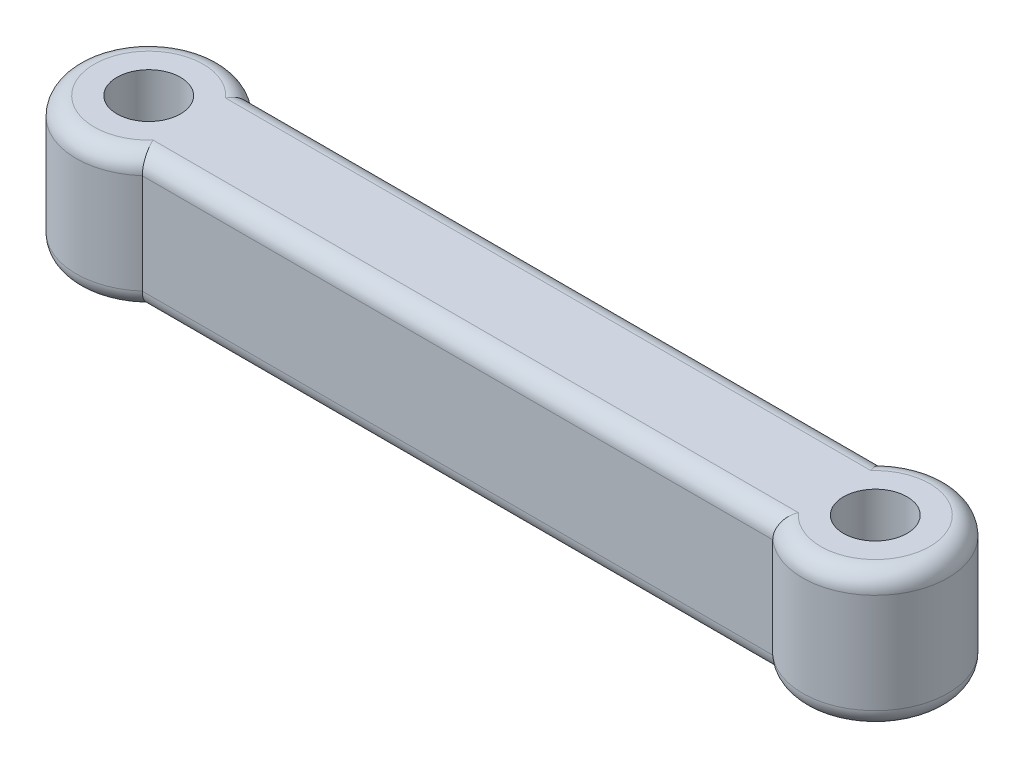
ISO-10303-21;
HEADER;
FILE_DESCRIPTION(('STEP AP214'),'2;1');
FILE_NAME('part.step','',(''),(''),'','','');
FILE_SCHEMA(('AUTOMOTIVE_DESIGN { 1 0 10303 214 1 1 1 1 }'));
ENDSEC;
DATA;
#1=APPLICATION_CONTEXT('core data for automotive mechanical design processes');
#2=APPLICATION_PROTOCOL_DEFINITION('international standard','automotive_design',2000,#1);
#3=PRODUCT_CONTEXT('',#1,'mechanical');
#4=PRODUCT('Part','Part','',(#3));
#5=PRODUCT_RELATED_PRODUCT_CATEGORY('part','',(#4));
#6=PRODUCT_DEFINITION_FORMATION('','',#4);
#7=PRODUCT_DEFINITION_CONTEXT('part definition',#1,'design');
#8=PRODUCT_DEFINITION('design','',#6,#7);
#9=PRODUCT_DEFINITION_SHAPE('','',#8);
#10=(LENGTH_UNIT() NAMED_UNIT(*) SI_UNIT(.MILLI.,.METRE.));
#11=(NAMED_UNIT(*) PLANE_ANGLE_UNIT() SI_UNIT($,.RADIAN.));
#12=(NAMED_UNIT(*) SI_UNIT($,.STERADIAN.) SOLID_ANGLE_UNIT());
#13=UNCERTAINTY_MEASURE_WITH_UNIT(LENGTH_MEASURE(1.E-05),#10,'distance_accuracy_value','');
#14=(GEOMETRIC_REPRESENTATION_CONTEXT(3) GLOBAL_UNCERTAINTY_ASSIGNED_CONTEXT((#13)) GLOBAL_UNIT_ASSIGNED_CONTEXT((#10,
#11,#12)) REPRESENTATION_CONTEXT('',''));
#15=CARTESIAN_POINT('',(0.,0.,0.));
#16=DIRECTION('',(0.,0.,1.));
#17=DIRECTION('',(1.,0.,0.));
#18=AXIS2_PLACEMENT_3D('',#15,#16,#17);
#19=CARTESIAN_POINT('',(0.,7.5,0.));
#20=DIRECTION('',(0.,-1.,0.));
#21=DIRECTION('',(0.,0.,-1.));
#22=AXIS2_PLACEMENT_3D('',#19,#20,#21);
#23=CYLINDRICAL_SURFACE('',#22,4.);
#24=DIRECTION('',(0.,-1.,0.));
#25=VECTOR('',#24,1.);
#26=CARTESIAN_POINT('',(2.6457513110646,7.5,-3.));
#27=LINE('',#26,#25);
#28=CARTESIAN_POINT('',(2.6457513110646,6.5,-3.));
#29=VERTEX_POINT('',#28);
#30=CARTESIAN_POINT('',(2.6457513110646,1.,-3.));
#31=VERTEX_POINT('',#30);
#32=EDGE_CURVE('E94',#29,#31,#27,.T.);
#33=ORIENTED_EDGE('',*,*,#32,.T.);
#34=CARTESIAN_POINT('',(0.,1.,0.));
#35=DIRECTION('',(0.,1.,0.));
#36=DIRECTION('',(0.,0.,1.));
#37=AXIS2_PLACEMENT_3D('',#34,#35,#36);
#38=CIRCLE('',#37,4.);
#39=CARTESIAN_POINT('',(2.6457513110646,1.,3.));
#40=VERTEX_POINT('',#39);
#41=EDGE_CURVE('E223',#31,#40,#38,.T.);
#42=ORIENTED_EDGE('',*,*,#41,.T.);
#43=DIRECTION('',(0.,-1.,0.));
#44=VECTOR('',#43,1.);
#45=CARTESIAN_POINT('',(2.6457513110646,7.5,3.));
#46=LINE('',#45,#44);
#47=CARTESIAN_POINT('',(2.6457513110646,6.5,3.));
#48=VERTEX_POINT('',#47);
#49=EDGE_CURVE('E116',#48,#40,#46,.T.);
#50=ORIENTED_EDGE('',*,*,#49,.F.);
#51=CARTESIAN_POINT('',(0.,6.5,0.));
#52=DIRECTION('',(0.,1.,0.));
#53=DIRECTION('',(0.,0.,1.));
#54=AXIS2_PLACEMENT_3D('',#51,#52,#53);
#55=CIRCLE('',#54,4.);
#56=EDGE_CURVE('E237',#48,#29,#55,.F.);
#57=ORIENTED_EDGE('',*,*,#56,.T.);
#58=EDGE_LOOP('',(#33,#42,#50,#57));
#59=FACE_BOUND('',#58,.T.);
#60=ADVANCED_FACE('F16',(#59),#23,.T.);
#61=CARTESIAN_POINT('',(0.,7.5,3.));
#62=DIRECTION('',(0.,0.,1.));
#63=DIRECTION('',(1.,0.,0.));
#64=AXIS2_PLACEMENT_3D('',#61,#62,#63);
#65=PLANE('',#64);
#66=ORIENTED_EDGE('',*,*,#49,.T.);
#67=DIRECTION('',(-1.,0.,0.));
#68=VECTOR('',#67,1.);
#69=CARTESIAN_POINT('',(37.3542486889354,1.,3.));
#70=LINE('',#69,#68);
#71=CARTESIAN_POINT('',(37.3542486889354,1.,3.));
#72=VERTEX_POINT('',#71);
#73=EDGE_CURVE('E242',#40,#72,#70,.F.);
#74=ORIENTED_EDGE('',*,*,#73,.T.);
#75=DIRECTION('',(0.,-1.,0.));
#76=VECTOR('',#75,1.);
#77=CARTESIAN_POINT('',(37.3542486889354,7.5,3.));
#78=LINE('',#77,#76);
#79=CARTESIAN_POINT('',(37.3542486889354,6.5,3.));
#80=VERTEX_POINT('',#79);
#81=EDGE_CURVE('E110',#80,#72,#78,.T.);
#82=ORIENTED_EDGE('',*,*,#81,.F.);
#83=DIRECTION('',(-1.,0.,0.));
#84=VECTOR('',#83,1.);
#85=CARTESIAN_POINT('',(0.,6.5,3.));
#86=LINE('',#85,#84);
#87=EDGE_CURVE('E240',#80,#48,#86,.T.);
#88=ORIENTED_EDGE('',*,*,#87,.T.);
#89=EDGE_LOOP('',(#66,#74,#82,#88));
#90=FACE_BOUND('',#89,.T.);
#91=ADVANCED_FACE('F159',(#90),#65,.T.);
#92=CARTESIAN_POINT('',(40.,7.5,0.));
#93=DIRECTION('',(0.,-1.,0.));
#94=DIRECTION('',(0.,0.,-1.));
#95=AXIS2_PLACEMENT_3D('',#92,#93,#94);
#96=CYLINDRICAL_SURFACE('',#95,4.);
#97=ORIENTED_EDGE('',*,*,#81,.T.);
#98=CARTESIAN_POINT('',(40.,1.,0.));
#99=DIRECTION('',(0.,1.,0.));
#100=DIRECTION('',(0.,0.,1.));
#101=AXIS2_PLACEMENT_3D('',#98,#99,#100);
#102=CIRCLE('',#101,4.);
#103=CARTESIAN_POINT('',(37.3542486889354,1.,-3.));
#104=VERTEX_POINT('',#103);
#105=EDGE_CURVE('E109',#72,#104,#102,.T.);
#106=ORIENTED_EDGE('',*,*,#105,.T.);
#107=DIRECTION('',(0.,-1.,0.));
#108=VECTOR('',#107,1.);
#109=CARTESIAN_POINT('',(37.3542486889354,7.5,-3.));
#110=LINE('',#109,#108);
#111=CARTESIAN_POINT('',(37.3542486889354,6.5,-3.));
#112=VERTEX_POINT('',#111);
#113=EDGE_CURVE('E92',#112,#104,#110,.T.);
#114=ORIENTED_EDGE('',*,*,#113,.F.);
#115=CARTESIAN_POINT('',(40.,6.5,0.));
#116=DIRECTION('',(0.,1.,0.));
#117=DIRECTION('',(0.,0.,1.));
#118=AXIS2_PLACEMENT_3D('',#115,#116,#117);
#119=CIRCLE('',#118,4.);
#120=EDGE_CURVE('E106',#112,#80,#119,.F.);
#121=ORIENTED_EDGE('',*,*,#120,.T.);
#122=EDGE_LOOP('',(#97,#106,#114,#121));
#123=FACE_BOUND('',#122,.T.);
#124=ADVANCED_FACE('F105',(#123),#96,.T.);
#125=CARTESIAN_POINT('',(0.,7.5,-3.));
#126=DIRECTION('',(0.,0.,1.));
#127=DIRECTION('',(1.,0.,0.));
#128=AXIS2_PLACEMENT_3D('',#125,#126,#127);
#129=PLANE('',#128);
#130=ORIENTED_EDGE('',*,*,#113,.T.);
#131=DIRECTION('',(-1.,0.,0.));
#132=VECTOR('',#131,1.);
#133=CARTESIAN_POINT('',(0.,1.,-3.));
#134=LINE('',#133,#132);
#135=EDGE_CURVE('E98',#104,#31,#134,.T.);
#136=ORIENTED_EDGE('',*,*,#135,.T.);
#137=ORIENTED_EDGE('',*,*,#32,.F.);
#138=DIRECTION('',(-1.,0.,0.));
#139=VECTOR('',#138,1.);
#140=CARTESIAN_POINT('',(37.3542486889354,6.5,-3.));
#141=LINE('',#140,#139);
#142=EDGE_CURVE('E89',#29,#112,#141,.F.);
#143=ORIENTED_EDGE('',*,*,#142,.T.);
#144=EDGE_LOOP('',(#130,#136,#137,#143));
#145=FACE_BOUND('',#144,.T.);
#146=ADVANCED_FACE('F91',(#145),#129,.F.);
#147=CARTESIAN_POINT('',(0.,7.5,0.));
#148=DIRECTION('',(0.,-1.,0.));
#149=DIRECTION('',(0.,0.,-1.));
#150=AXIS2_PLACEMENT_3D('',#147,#148,#149);
#151=CYLINDRICAL_SURFACE('',#150,1.75);
#152=CARTESIAN_POINT('',(0.,7.5,0.));
#153=DIRECTION('',(0.,1.,0.));
#154=DIRECTION('',(0.,0.,1.));
#155=AXIS2_PLACEMENT_3D('',#152,#153,#154);
#156=CIRCLE('',#155,1.75);
#157=CARTESIAN_POINT('',(0.,7.5,1.75));
#158=VERTEX_POINT('',#157);
#159=EDGE_CURVE('E267',#158,#158,#156,.T.);
#160=ORIENTED_EDGE('',*,*,#159,.T.);
#161=EDGE_LOOP('',(#160));
#162=FACE_BOUND('',#161,.T.);
#163=CARTESIAN_POINT('',(0.,0.,0.));
#164=DIRECTION('',(0.,1.,0.));
#165=DIRECTION('',(0.,0.,1.));
#166=AXIS2_PLACEMENT_3D('',#163,#164,#165);
#167=CIRCLE('',#166,1.75);
#168=CARTESIAN_POINT('',(0.,0.,1.75));
#169=VERTEX_POINT('',#168);
#170=EDGE_CURVE('E261',#169,#169,#167,.T.);
#171=ORIENTED_EDGE('',*,*,#170,.F.);
#172=EDGE_LOOP('',(#171));
#173=FACE_BOUND('',#172,.T.);
#174=ADVANCED_FACE('F169',(#162,#173),#151,.F.);
#175=CARTESIAN_POINT('',(40.,7.5,0.));
#176=DIRECTION('',(0.,-1.,0.));
#177=DIRECTION('',(0.,0.,-1.));
#178=AXIS2_PLACEMENT_3D('',#175,#176,#177);
#179=CYLINDRICAL_SURFACE('',#178,1.75);
#180=CARTESIAN_POINT('',(40.,7.5,0.));
#181=DIRECTION('',(0.,1.,0.));
#182=DIRECTION('',(0.,0.,1.));
#183=AXIS2_PLACEMENT_3D('',#180,#181,#182);
#184=CIRCLE('',#183,1.75);
#185=CARTESIAN_POINT('',(40.,7.5,1.75));
#186=VERTEX_POINT('',#185);
#187=EDGE_CURVE('E270',#186,#186,#184,.T.);
#188=ORIENTED_EDGE('',*,*,#187,.T.);
#189=EDGE_LOOP('',(#188));
#190=FACE_BOUND('',#189,.T.);
#191=CARTESIAN_POINT('',(40.,0.,0.));
#192=DIRECTION('',(0.,1.,0.));
#193=DIRECTION('',(0.,0.,1.));
#194=AXIS2_PLACEMENT_3D('',#191,#192,#193);
#195=CIRCLE('',#194,1.75);
#196=CARTESIAN_POINT('',(40.,0.,1.75));
#197=VERTEX_POINT('',#196);
#198=EDGE_CURVE('E263',#197,#197,#195,.T.);
#199=ORIENTED_EDGE('',*,*,#198,.F.);
#200=EDGE_LOOP('',(#199));
#201=FACE_BOUND('',#200,.T.);
#202=ADVANCED_FACE('F172',(#190,#201),#179,.F.);
#203=CARTESIAN_POINT('',(0.,7.5,0.));
#204=DIRECTION('',(0.,1.,0.));
#205=DIRECTION('',(0.,0.,1.));
#206=AXIS2_PLACEMENT_3D('',#203,#204,#205);
#207=PLANE('',#206);
#208=DIRECTION('',(-1.,0.,0.));
#209=VECTOR('',#208,1.);
#210=CARTESIAN_POINT('',(0.,7.5,2.));
#211=LINE('',#210,#209);
#212=CARTESIAN_POINT('',(2.23606797749979,7.5,2.));
#213=VERTEX_POINT('',#212);
#214=CARTESIAN_POINT('',(37.7639320225002,7.5,2.));
#215=VERTEX_POINT('',#214);
#216=EDGE_CURVE('E244',#213,#215,#211,.F.);
#217=ORIENTED_EDGE('',*,*,#216,.T.);
#218=CARTESIAN_POINT('',(40.,7.5,0.));
#219=DIRECTION('',(0.,1.,0.));
#220=DIRECTION('',(0.,0.,1.));
#221=AXIS2_PLACEMENT_3D('',#218,#219,#220);
#222=CIRCLE('',#221,3.);
#223=CARTESIAN_POINT('',(37.7639320225002,7.5,-2.));
#224=VERTEX_POINT('',#223);
#225=EDGE_CURVE('E11',#215,#224,#222,.T.);
#226=ORIENTED_EDGE('',*,*,#225,.T.);
#227=DIRECTION('',(-1.,0.,0.));
#228=VECTOR('',#227,1.);
#229=CARTESIAN_POINT('',(2.6457513110646,7.5,-2.));
#230=LINE('',#229,#228);
#231=CARTESIAN_POINT('',(2.2360679774998,7.5,-2.));
#232=VERTEX_POINT('',#231);
#233=EDGE_CURVE('E30',#224,#232,#230,.T.);
#234=ORIENTED_EDGE('',*,*,#233,.T.);
#235=CARTESIAN_POINT('',(0.,7.5,0.));
#236=DIRECTION('',(0.,1.,0.));
#237=DIRECTION('',(0.,0.,1.));
#238=AXIS2_PLACEMENT_3D('',#235,#236,#237);
#239=CIRCLE('',#238,3.);
#240=EDGE_CURVE('E246',#232,#213,#239,.T.);
#241=ORIENTED_EDGE('',*,*,#240,.T.);
#242=EDGE_LOOP('',(#217,#226,#234,#241));
#243=FACE_BOUND('',#242,.T.);
#244=ORIENTED_EDGE('',*,*,#159,.F.);
#245=EDGE_LOOP('',(#244));
#246=FACE_BOUND('',#245,.T.);
#247=ORIENTED_EDGE('',*,*,#187,.F.);
#248=EDGE_LOOP('',(#247));
#249=FACE_BOUND('',#248,.T.);
#250=ADVANCED_FACE('F212',(#243,#246,#249),#207,.T.);
#251=CARTESIAN_POINT('',(0.,0.,0.));
#252=DIRECTION('',(0.,1.,0.));
#253=DIRECTION('',(0.,0.,1.));
#254=AXIS2_PLACEMENT_3D('',#251,#252,#253);
#255=PLANE('',#254);
#256=DIRECTION('',(-1.,0.,0.));
#257=VECTOR('',#256,1.);
#258=CARTESIAN_POINT('',(0.,0.,-2.));
#259=LINE('',#258,#257);
#260=CARTESIAN_POINT('',(2.2360679774998,0.,-2.));
#261=VERTEX_POINT('',#260);
#262=CARTESIAN_POINT('',(37.7639320225002,0.,-2.));
#263=VERTEX_POINT('',#262);
#264=EDGE_CURVE('E227',#261,#263,#259,.F.);
#265=ORIENTED_EDGE('',*,*,#264,.T.);
#266=CARTESIAN_POINT('',(40.,0.,0.));
#267=DIRECTION('',(0.,1.,0.));
#268=DIRECTION('',(0.,0.,1.));
#269=AXIS2_PLACEMENT_3D('',#266,#267,#268);
#270=CIRCLE('',#269,3.);
#271=CARTESIAN_POINT('',(37.7639320225002,0.,2.));
#272=VERTEX_POINT('',#271);
#273=EDGE_CURVE('E99',#263,#272,#270,.F.);
#274=ORIENTED_EDGE('',*,*,#273,.T.);
#275=DIRECTION('',(-1.,0.,0.));
#276=VECTOR('',#275,1.);
#277=CARTESIAN_POINT('',(2.6457513110646,0.,2.));
#278=LINE('',#277,#276);
#279=CARTESIAN_POINT('',(2.23606797749979,0.,2.));
#280=VERTEX_POINT('',#279);
#281=EDGE_CURVE('E232',#272,#280,#278,.T.);
#282=ORIENTED_EDGE('',*,*,#281,.T.);
#283=CARTESIAN_POINT('',(0.,0.,0.));
#284=DIRECTION('',(0.,1.,0.));
#285=DIRECTION('',(0.,0.,1.));
#286=AXIS2_PLACEMENT_3D('',#283,#284,#285);
#287=CIRCLE('',#286,3.);
#288=EDGE_CURVE('E221',#280,#261,#287,.F.);
#289=ORIENTED_EDGE('',*,*,#288,.T.);
#290=EDGE_LOOP('',(#265,#274,#282,#289));
#291=FACE_BOUND('',#290,.T.);
#292=ORIENTED_EDGE('',*,*,#170,.T.);
#293=EDGE_LOOP('',(#292));
#294=FACE_BOUND('',#293,.T.);
#295=ORIENTED_EDGE('',*,*,#198,.T.);
#296=EDGE_LOOP('',(#295));
#297=FACE_BOUND('',#296,.T.);
#298=ADVANCED_FACE('F206',(#291,#294,#297),#255,.F.);
#299=CARTESIAN_POINT('',(0.,1.,0.));
#300=DIRECTION('',(0.,1.,0.));
#301=DIRECTION('',(0.,0.,1.));
#302=AXIS2_PLACEMENT_3D('',#299,#300,#301);
#303=TOROIDAL_SURFACE('',#302,3.,1.);
#304=CARTESIAN_POINT('',(2.6457513110646,1.,-3.));
#305=CARTESIAN_POINT('',(2.64575127092674,0.973228555836765,-3.00000069615422));
#306=CARTESIAN_POINT('',(2.64534472387869,0.946470374588335,-2.99892418210553));
#307=CARTESIAN_POINT('',(2.64372309753721,0.893154745547511,-2.99463542267004));
#308=CARTESIAN_POINT('',(2.6425081506653,0.866597265599314,-2.99142352707368));
#309=CARTESIAN_POINT('',(2.63766755879304,0.787642395185727,-2.97863953817245));
#310=CARTESIAN_POINT('',(2.63284608949272,0.735789427416032,-2.96591886758874));
#311=CARTESIAN_POINT('',(2.62014889631173,0.635132507808938,-2.93257021261229));
#312=CARTESIAN_POINT('',(2.6122734290892,0.586328300153661,-2.91194289269645));
#313=CARTESIAN_POINT('',(2.59367806237857,0.492986585810994,-2.86353983623308));
#314=CARTESIAN_POINT('',(2.58295750011554,0.448450076593601,-2.83576243409405));
#315=CARTESIAN_POINT('',(2.5586466526755,0.363675490639332,-2.77326086489196));
#316=CARTESIAN_POINT('',(2.54499277783535,0.323568675850964,-2.73838385103096));
#317=CARTESIAN_POINT('',(2.51530582313919,0.24977021914481,-2.66327163173881));
#318=CARTESIAN_POINT('',(2.49927205306725,0.216080444787168,-2.62303487222554));
#319=CARTESIAN_POINT('',(2.46413572570384,0.153868158072763,-2.53581906446158));
#320=CARTESIAN_POINT('',(2.44490584872289,0.125784424606513,-2.48857881181936));
#321=CARTESIAN_POINT('',(2.40457913446054,0.077914490927446,-2.39079733884034));
#322=CARTESIAN_POINT('',(2.38348165304688,0.0581311671146035,-2.3402549812023));
#323=CARTESIAN_POINT('',(2.34215580757248,0.0286919397689751,-2.24265609980384));
#324=CARTESIAN_POINT('',(2.32206840218565,0.0181914124767634,-2.19579002502582));
#325=CARTESIAN_POINT('',(2.28108331255519,0.00402153912134074,-2.10146140103966));
#326=CARTESIAN_POINT('',(2.26018725358578,0.00033915042658557,-2.05400016588306));
#327=CARTESIAN_POINT('',(2.23806117954649,7.43641947154835E-06,-2.00445841648615));
#328=CARTESIAN_POINT('',(2.23706482870276,-1.78314518430361E-08,-2.00222901681706));
#329=CARTESIAN_POINT('',(2.2360679774998,0.,-2.));
#330=B_SPLINE_CURVE_WITH_KNOTS('',3,(#304,#305,#306,#307,#308,#309,#310,#311,#312,#313,#314,
#315,#316,#317,#318,#319,#320,#321,#322,#323,#324,#325,#326,#327,#328,#329),.UNSPECIFIED.,.F.,
.F.,(4,2,2,2,2,2,2,2,2,2,2,2,4),(0.,0.0802634951669375,0.160513845850261,0.320501915607237,
0.480476542871452,0.640488469552238,0.804401347479019,0.968361856552137,1.14229241042013,
1.31628318799655,1.47202369345237,1.62746596897456,1.63479168634692),.UNSPECIFIED.);
#331=EDGE_CURVE('E193',#261,#31,#330,.F.);
#332=ORIENTED_EDGE('',*,*,#331,.F.);
#333=ORIENTED_EDGE('',*,*,#288,.F.);
#334=CARTESIAN_POINT('',(2.6457513110646,1.,3.));
#335=CARTESIAN_POINT('',(2.64575127092673,0.973228555836765,3.00000069615423));
#336=CARTESIAN_POINT('',(2.64534472387869,0.946470374588335,2.99892418210553));
#337=CARTESIAN_POINT('',(2.64372309753721,0.893154745547511,2.99463542267004));
#338=CARTESIAN_POINT('',(2.6425081506653,0.866597265599313,2.99142352707368));
#339=CARTESIAN_POINT('',(2.63766755879304,0.787642395185727,2.97863953817245));
#340=CARTESIAN_POINT('',(2.63284608949271,0.73578942741603,2.96591886758875));
#341=CARTESIAN_POINT('',(2.62014889631172,0.635132507808937,2.9325702126123));
#342=CARTESIAN_POINT('',(2.6122734290892,0.586328300153662,2.91194289269645));
#343=CARTESIAN_POINT('',(2.59367806237857,0.492986585810996,2.86353983623308));
#344=CARTESIAN_POINT('',(2.58295750011553,0.448450076593601,2.83576243409405));
#345=CARTESIAN_POINT('',(2.55864665267549,0.363675490639332,2.77326086489196));
#346=CARTESIAN_POINT('',(2.54499277783535,0.323568675850966,2.73838385103096));
#347=CARTESIAN_POINT('',(2.51530582313919,0.249770219144811,2.66327163173881));
#348=CARTESIAN_POINT('',(2.49927205306724,0.216080444787167,2.62303487222555));
#349=CARTESIAN_POINT('',(2.46413572570383,0.153868158072763,2.53581906446159));
#350=CARTESIAN_POINT('',(2.44490584872289,0.125784424606514,2.48857881181936));
#351=CARTESIAN_POINT('',(2.40457913446054,0.0779144909274477,2.39079733884034));
#352=CARTESIAN_POINT('',(2.38348165304688,0.0581311671146037,2.3402549812023));
#353=CARTESIAN_POINT('',(2.34215580757246,0.0286919397689751,2.24265609980385));
#354=CARTESIAN_POINT('',(2.32206840218562,0.0181914124767641,2.19579002502583));
#355=CARTESIAN_POINT('',(2.28108331255522,0.00402153912134111,2.10146140103965));
#356=CARTESIAN_POINT('',(2.26018725358588,0.000339150426584755,2.05400016588302));
#357=CARTESIAN_POINT('',(2.23806117954649,7.43641947144235E-06,2.00445841648616));
#358=CARTESIAN_POINT('',(2.23706482870276,-1.78314519116548E-08,2.00222901681706));
#359=CARTESIAN_POINT('',(2.23606797749979,0.,2.));
#360=B_SPLINE_CURVE_WITH_KNOTS('',3,(#334,#335,#336,#337,#338,#339,#340,#341,#342,#343,#344,
#345,#346,#347,#348,#349,#350,#351,#352,#353,#354,#355,#356,#357,#358,#359),.UNSPECIFIED.,.F.,
.F.,(4,2,2,2,2,2,2,2,2,2,2,2,4),(0.,0.0802634951669372,0.160513845850261,0.320501915607237,
0.480476542871452,0.640488469552238,0.804401347479018,0.968361856552134,1.14229241042013,
1.31628318799655,1.47202369345237,1.62746596897455,1.63479168634692),.UNSPECIFIED.);
#361=EDGE_CURVE('E129',#40,#280,#360,.T.);
#362=ORIENTED_EDGE('',*,*,#361,.F.);
#363=ORIENTED_EDGE('',*,*,#41,.F.);
#364=EDGE_LOOP('',(#332,#333,#362,#363));
#365=FACE_BOUND('',#364,.T.);
#366=ADVANCED_FACE('F201',(#365),#303,.T.);
#367=CARTESIAN_POINT('',(0.,1.,2.));
#368=DIRECTION('',(1.,0.,0.));
#369=DIRECTION('',(0.,0.,-1.));
#370=AXIS2_PLACEMENT_3D('',#367,#368,#369);
#371=CYLINDRICAL_SURFACE('',#370,1.);
#372=ORIENTED_EDGE('',*,*,#361,.T.);
#373=ORIENTED_EDGE('',*,*,#281,.F.);
#374=CARTESIAN_POINT('',(37.3542486889354,1.,3.));
#375=CARTESIAN_POINT('',(37.3542487290733,0.973228555836765,3.00000069615422));
#376=CARTESIAN_POINT('',(37.3546552761213,0.946470374588335,2.99892418210553));
#377=CARTESIAN_POINT('',(37.3562769024628,0.893154745547511,2.99463542267003));
#378=CARTESIAN_POINT('',(37.3574918493347,0.866597265599314,2.99142352707368));
#379=CARTESIAN_POINT('',(37.362332441207,0.787642395185727,2.97863953817245));
#380=CARTESIAN_POINT('',(37.3671539105073,0.735789427416031,2.96591886758874));
#381=CARTESIAN_POINT('',(37.3798511036883,0.635132507808937,2.93257021261229));
#382=CARTESIAN_POINT('',(37.3877265709108,0.58632830015366,2.91194289269644));
#383=CARTESIAN_POINT('',(37.4063219376214,0.492986585810994,2.86353983623308));
#384=CARTESIAN_POINT('',(37.4170424998845,0.448450076593601,2.83576243409405));
#385=CARTESIAN_POINT('',(37.4413533473245,0.363675490639332,2.77326086489196));
#386=CARTESIAN_POINT('',(37.4550072221646,0.323568675850963,2.73838385103095));
#387=CARTESIAN_POINT('',(37.4846941768608,0.249770219144809,2.66327163173881));
#388=CARTESIAN_POINT('',(37.5007279469328,0.216080444787168,2.62303487222555));
#389=CARTESIAN_POINT('',(37.5358642742962,0.153868158072763,2.53581906446158));
#390=CARTESIAN_POINT('',(37.5550941512771,0.125784424606511,2.48857881181935));
#391=CARTESIAN_POINT('',(37.5954208655395,0.077914490927445,2.39079733884033));
#392=CARTESIAN_POINT('',(37.6165183469532,0.0581311671146037,2.3402549812023));
#393=CARTESIAN_POINT('',(37.6578441924275,0.0286919397689766,2.24265609980385));
#394=CARTESIAN_POINT('',(37.6779315978143,0.0181914124767646,2.19579002502581));
#395=CARTESIAN_POINT('',(37.7189166874448,0.00402153912134098,2.10146140103967));
#396=CARTESIAN_POINT('',(37.7398127464143,0.000339150426585215,2.05400016588309));
#397=CARTESIAN_POINT('',(37.7619388204535,7.43641947148521E-06,2.00445841648616));
#398=CARTESIAN_POINT('',(37.7629351712972,-1.78314518897337E-08,2.00222901681706));
#399=CARTESIAN_POINT('',(37.7639320225002,0.,2.));
#400=B_SPLINE_CURVE_WITH_KNOTS('',3,(#374,#375,#376,#377,#378,#379,#380,#381,#382,#383,#384,
#385,#386,#387,#388,#389,#390,#391,#392,#393,#394,#395,#396,#397,#398,#399),.UNSPECIFIED.,.F.,
.F.,(4,2,2,2,2,2,2,2,2,2,2,2,4),(0.,0.0802634951669373,0.160513845850261,0.320501915607238,
0.480476542871452,0.640488469552238,0.80440134747902,0.968361856552137,1.14229241042014,
1.31628318799656,1.47202369345237,1.62746596897454,1.63479168634691),.UNSPECIFIED.);
#401=EDGE_CURVE('E188',#72,#272,#400,.T.);
#402=ORIENTED_EDGE('',*,*,#401,.F.);
#403=ORIENTED_EDGE('',*,*,#73,.F.);
#404=EDGE_LOOP('',(#372,#373,#402,#403));
#405=FACE_BOUND('',#404,.T.);
#406=ADVANCED_FACE('F198',(#405),#371,.T.);
#407=CARTESIAN_POINT('',(0.,1.,-2.));
#408=DIRECTION('',(-1.,0.,0.));
#409=DIRECTION('',(0.,0.,1.));
#410=AXIS2_PLACEMENT_3D('',#407,#408,#409);
#411=CYLINDRICAL_SURFACE('',#410,1.);
#412=ORIENTED_EDGE('',*,*,#331,.T.);
#413=ORIENTED_EDGE('',*,*,#135,.F.);
#414=CARTESIAN_POINT('',(37.3542486889354,1.,-3.));
#415=CARTESIAN_POINT('',(37.3542487290733,0.973228555836765,-3.00000069615423));
#416=CARTESIAN_POINT('',(37.3546552761213,0.946470374588334,-2.99892418210553));
#417=CARTESIAN_POINT('',(37.3562769024628,0.89315474554751,-2.99463542267005));
#418=CARTESIAN_POINT('',(37.3574918493347,0.866597265599313,-2.99142352707369));
#419=CARTESIAN_POINT('',(37.362332441207,0.787642395185727,-2.97863953817245));
#420=CARTESIAN_POINT('',(37.3671539105073,0.735789427416032,-2.96591886758874));
#421=CARTESIAN_POINT('',(37.3798511036883,0.635132507808937,-2.93257021261229));
#422=CARTESIAN_POINT('',(37.3877265709108,0.586328300153658,-2.91194289269645));
#423=CARTESIAN_POINT('',(37.4063219376214,0.492986585810992,-2.86353983623309));
#424=CARTESIAN_POINT('',(37.4170424998845,0.448450076593601,-2.83576243409405));
#425=CARTESIAN_POINT('',(37.4413533473245,0.363675490639332,-2.77326086489196));
#426=CARTESIAN_POINT('',(37.4550072221647,0.323568675850962,-2.73838385103096));
#427=CARTESIAN_POINT('',(37.4846941768608,0.249770219144807,-2.66327163173881));
#428=CARTESIAN_POINT('',(37.5007279469328,0.216080444787168,-2.62303487222555));
#429=CARTESIAN_POINT('',(37.5358642742962,0.153868158072763,-2.53581906446158));
#430=CARTESIAN_POINT('',(37.5550941512771,0.125784424606509,-2.48857881181935));
#431=CARTESIAN_POINT('',(37.5954208655395,0.0779144909274432,-2.39079733884034));
#432=CARTESIAN_POINT('',(37.6165183469532,0.0581311671146037,-2.3402549812023));
#433=CARTESIAN_POINT('',(37.6578441924275,0.0286919397689769,-2.24265609980385));
#434=CARTESIAN_POINT('',(37.6779315978144,0.0181914124767637,-2.19579002502582));
#435=CARTESIAN_POINT('',(37.7189166874448,0.00402153912134056,-2.10146140103967));
#436=CARTESIAN_POINT('',(37.7398127464143,0.000339150426586675,-2.05400016588309));
#437=CARTESIAN_POINT('',(37.7619388204535,7.43641947162568E-06,-2.00445841648616));
#438=CARTESIAN_POINT('',(37.7629351712972,-1.78314518156578E-08,-2.00222901681706));
#439=CARTESIAN_POINT('',(37.7639320225002,0.,-2.));
#440=B_SPLINE_CURVE_WITH_KNOTS('',3,(#414,#415,#416,#417,#418,#419,#420,#421,#422,#423,#424,
#425,#426,#427,#428,#429,#430,#431,#432,#433,#434,#435,#436,#437,#438,#439),.UNSPECIFIED.,.F.,
.F.,(4,2,2,2,2,2,2,2,2,2,2,2,4),(0.,0.0802634951669383,0.160513845850261,0.320501915607239,
0.480476542871454,0.64048846955224,0.804401347479021,0.968361856552139,1.14229241042014,
1.31628318799656,1.47202369345237,1.62746596897454,1.63479168634692),.UNSPECIFIED.);
#441=EDGE_CURVE('E182',#263,#104,#440,.F.);
#442=ORIENTED_EDGE('',*,*,#441,.F.);
#443=ORIENTED_EDGE('',*,*,#264,.F.);
#444=EDGE_LOOP('',(#412,#413,#442,#443));
#445=FACE_BOUND('',#444,.T.);
#446=ADVANCED_FACE('F177',(#445),#411,.T.);
#447=CARTESIAN_POINT('',(40.,1.,0.));
#448=DIRECTION('',(0.,1.,0.));
#449=DIRECTION('',(0.,0.,1.));
#450=AXIS2_PLACEMENT_3D('',#447,#448,#449);
#451=TOROIDAL_SURFACE('',#450,3.,1.);
#452=ORIENTED_EDGE('',*,*,#401,.T.);
#453=ORIENTED_EDGE('',*,*,#273,.F.);
#454=ORIENTED_EDGE('',*,*,#441,.T.);
#455=ORIENTED_EDGE('',*,*,#105,.F.);
#456=EDGE_LOOP('',(#452,#453,#454,#455));
#457=FACE_BOUND('',#456,.T.);
#458=ADVANCED_FACE('F155',(#457),#451,.T.);
#459=CARTESIAN_POINT('',(0.,6.5,0.));
#460=DIRECTION('',(0.,1.,0.));
#461=DIRECTION('',(0.,0.,1.));
#462=AXIS2_PLACEMENT_3D('',#459,#460,#461);
#463=TOROIDAL_SURFACE('',#462,3.,1.);
#464=CARTESIAN_POINT('',(2.6457513110646,6.5,-3.));
#465=CARTESIAN_POINT('',(2.64575127092673,6.52677144416323,-3.00000069615422));
#466=CARTESIAN_POINT('',(2.64534472387869,6.55352962541166,-2.99892418210553));
#467=CARTESIAN_POINT('',(2.64372309753721,6.60684525445249,-2.99463542267004));
#468=CARTESIAN_POINT('',(2.6425081506653,6.63340273440068,-2.99142352707368));
#469=CARTESIAN_POINT('',(2.63766755879304,6.71235760481427,-2.97863953817245));
#470=CARTESIAN_POINT('',(2.63284608949271,6.76421057258397,-2.96591886758874));
#471=CARTESIAN_POINT('',(2.62014889631172,6.86486749219106,-2.93257021261229));
#472=CARTESIAN_POINT('',(2.6122734290892,6.91367169984634,-2.91194289269645));
#473=CARTESIAN_POINT('',(2.59367806237857,7.00701341418901,-2.86353983623308));
#474=CARTESIAN_POINT('',(2.58295750011554,7.0515499234064,-2.83576243409405));
#475=CARTESIAN_POINT('',(2.5586466526755,7.13632450936067,-2.77326086489196));
#476=CARTESIAN_POINT('',(2.54499277783535,7.17643132414904,-2.73838385103096));
#477=CARTESIAN_POINT('',(2.51530582313919,7.25022978085519,-2.66327163173881));
#478=CARTESIAN_POINT('',(2.49927205306725,7.28391955521284,-2.62303487222554));
#479=CARTESIAN_POINT('',(2.46413572570384,7.34613184192724,-2.53581906446158));
#480=CARTESIAN_POINT('',(2.44490584872288,7.37421557539349,-2.48857881181936));
#481=CARTESIAN_POINT('',(2.40457913446054,7.42208550907255,-2.39079733884033));
#482=CARTESIAN_POINT('',(2.38348165304689,7.4418688328854,-2.34025498120229));
#483=CARTESIAN_POINT('',(2.34215580757247,7.47130806023103,-2.24265609980384));
#484=CARTESIAN_POINT('',(2.32206840218561,7.48180858752324,-2.19579002502583));
#485=CARTESIAN_POINT('',(2.28108331255523,7.49597846087865,-2.10146140103964));
#486=CARTESIAN_POINT('',(2.26018725358592,7.4996608495734,-2.054000165883));
#487=CARTESIAN_POINT('',(2.2380611795465,7.49999256358053,-2.00445841648615));
#488=CARTESIAN_POINT('',(2.23706482870277,7.50000001783145,-2.00222901681705));
#489=CARTESIAN_POINT('',(2.2360679774998,7.5,-2.));
#490=B_SPLINE_CURVE_WITH_KNOTS('',3,(#464,#465,#466,#467,#468,#469,#470,#471,#472,#473,#474,
#475,#476,#477,#478,#479,#480,#481,#482,#483,#484,#485,#486,#487,#488,#489),.UNSPECIFIED.,.F.,
.F.,(4,2,2,2,2,2,2,2,2,2,2,2,4),(0.,0.080263495166937,0.160513845850258,0.320501915607235,
0.480476542871453,0.64048846955224,0.804401347479021,0.968361856552141,1.14229241042014,
1.31628318799656,1.47202369345237,1.62746596897455,1.63479168634692),.UNSPECIFIED.);
#491=EDGE_CURVE('E120',#29,#232,#490,.T.);
#492=ORIENTED_EDGE('',*,*,#491,.F.);
#493=ORIENTED_EDGE('',*,*,#56,.F.);
#494=CARTESIAN_POINT('',(2.6457513110646,6.5,3.));
#495=CARTESIAN_POINT('',(2.64575127092673,6.52677144416323,3.00000069615423));
#496=CARTESIAN_POINT('',(2.64534472387869,6.55352962541166,2.99892418210553));
#497=CARTESIAN_POINT('',(2.64372309753721,6.60684525445249,2.99463542267004));
#498=CARTESIAN_POINT('',(2.6425081506653,6.63340273440068,2.99142352707368));
#499=CARTESIAN_POINT('',(2.63766755879304,6.71235760481427,2.97863953817245));
#500=CARTESIAN_POINT('',(2.63284608949271,6.76421057258397,2.96591886758875));
#501=CARTESIAN_POINT('',(2.62014889631172,6.86486749219106,2.9325702126123));
#502=CARTESIAN_POINT('',(2.6122734290892,6.91367169984634,2.91194289269645));
#503=CARTESIAN_POINT('',(2.59367806237857,7.00701341418901,2.86353983623308));
#504=CARTESIAN_POINT('',(2.58295750011553,7.0515499234064,2.83576243409405));
#505=CARTESIAN_POINT('',(2.55864665267549,7.13632450936067,2.77326086489196));
#506=CARTESIAN_POINT('',(2.54499277783535,7.17643132414904,2.73838385103096));
#507=CARTESIAN_POINT('',(2.51530582313919,7.25022978085519,2.66327163173881));
#508=CARTESIAN_POINT('',(2.49927205306724,7.28391955521284,2.62303487222555));
#509=CARTESIAN_POINT('',(2.46413572570383,7.34613184192724,2.53581906446159));
#510=CARTESIAN_POINT('',(2.44490584872289,7.37421557539349,2.48857881181936));
#511=CARTESIAN_POINT('',(2.40457913446054,7.42208550907255,2.39079733884034));
#512=CARTESIAN_POINT('',(2.38348165304688,7.4418688328854,2.3402549812023));
#513=CARTESIAN_POINT('',(2.34215580757246,7.47130806023103,2.24265609980385));
#514=CARTESIAN_POINT('',(2.32206840218561,7.48180858752324,2.19579002502584));
#515=CARTESIAN_POINT('',(2.28108331255523,7.49597846087865,2.10146140103965));
#516=CARTESIAN_POINT('',(2.26018725358592,7.4996608495734,2.05400016588301));
#517=CARTESIAN_POINT('',(2.2380611795465,7.49999256358053,2.00445841648616));
#518=CARTESIAN_POINT('',(2.23706482870276,7.50000001783145,2.00222901681706));
#519=CARTESIAN_POINT('',(2.23606797749979,7.5,2.));
#520=B_SPLINE_CURVE_WITH_KNOTS('',3,(#494,#495,#496,#497,#498,#499,#500,#501,#502,#503,#504,
#505,#506,#507,#508,#509,#510,#511,#512,#513,#514,#515,#516,#517,#518,#519),.UNSPECIFIED.,.F.,
.F.,(4,2,2,2,2,2,2,2,2,2,2,2,4),(0.,0.0802634951669361,0.160513845850259,0.320501915607233,
0.480476542871451,0.64048846955224,0.80440134747902,0.968361856552137,1.14229241042014,
1.31628318799655,1.47202369345237,1.62746596897455,1.63479168634692),.UNSPECIFIED.);
#521=EDGE_CURVE('E21',#213,#48,#520,.F.);
#522=ORIENTED_EDGE('',*,*,#521,.F.);
#523=ORIENTED_EDGE('',*,*,#240,.F.);
#524=EDGE_LOOP('',(#492,#493,#522,#523));
#525=FACE_BOUND('',#524,.T.);
#526=ADVANCED_FACE('F18',(#525),#463,.T.);
#527=CARTESIAN_POINT('',(0.,6.5,2.));
#528=DIRECTION('',(-1.,0.,0.));
#529=DIRECTION('',(0.,0.,1.));
#530=AXIS2_PLACEMENT_3D('',#527,#528,#529);
#531=CYLINDRICAL_SURFACE('',#530,1.);
#532=ORIENTED_EDGE('',*,*,#521,.T.);
#533=ORIENTED_EDGE('',*,*,#87,.F.);
#534=CARTESIAN_POINT('',(37.3542486889354,6.5,3.));
#535=CARTESIAN_POINT('',(37.3542487290733,6.52677144416323,3.00000069615422));
#536=CARTESIAN_POINT('',(37.3546552761213,6.55352962541166,2.99892418210553));
#537=CARTESIAN_POINT('',(37.3562769024628,6.60684525445249,2.99463542267003));
#538=CARTESIAN_POINT('',(37.3574918493347,6.63340273440068,2.99142352707368));
#539=CARTESIAN_POINT('',(37.362332441207,6.71235760481427,2.97863953817244));
#540=CARTESIAN_POINT('',(37.3671539105073,6.76421057258397,2.96591886758874));
#541=CARTESIAN_POINT('',(37.3798511036883,6.86486749219106,2.93257021261229));
#542=CARTESIAN_POINT('',(37.3877265709108,6.91367169984634,2.91194289269644));
#543=CARTESIAN_POINT('',(37.4063219376214,7.00701341418901,2.86353983623308));
#544=CARTESIAN_POINT('',(37.4170424998845,7.0515499234064,2.83576243409405));
#545=CARTESIAN_POINT('',(37.4413533473245,7.13632450936067,2.77326086489196));
#546=CARTESIAN_POINT('',(37.4550072221646,7.17643132414904,2.73838385103095));
#547=CARTESIAN_POINT('',(37.4846941768608,7.25022978085519,2.6632716317388));
#548=CARTESIAN_POINT('',(37.5007279469328,7.28391955521284,2.62303487222555));
#549=CARTESIAN_POINT('',(37.5358642742962,7.34613184192724,2.53581906446158));
#550=CARTESIAN_POINT('',(37.5550941512771,7.37421557539349,2.48857881181935));
#551=CARTESIAN_POINT('',(37.5954208655395,7.42208550907255,2.39079733884033));
#552=CARTESIAN_POINT('',(37.6165183469532,7.4418688328854,2.3402549812023));
#553=CARTESIAN_POINT('',(37.6578441924275,7.47130806023103,2.24265609980385));
#554=CARTESIAN_POINT('',(37.6779315978143,7.48180858752324,2.19579002502581));
#555=CARTESIAN_POINT('',(37.7189166874448,7.49597846087865,2.10146140103967));
#556=CARTESIAN_POINT('',(37.7398127464143,7.4996608495734,2.05400016588309));
#557=CARTESIAN_POINT('',(37.7619388204535,7.49999256358053,2.00445841648616));
#558=CARTESIAN_POINT('',(37.7629351712972,7.50000001783145,2.00222901681706));
#559=CARTESIAN_POINT('',(37.7639320225002,7.5,2.));
#560=B_SPLINE_CURVE_WITH_KNOTS('',3,(#534,#535,#536,#537,#538,#539,#540,#541,#542,#543,#544,
#545,#546,#547,#548,#549,#550,#551,#552,#553,#554,#555,#556,#557,#558,#559),.UNSPECIFIED.,.F.,
.F.,(4,2,2,2,2,2,2,2,2,2,2,2,4),(0.,0.0802634951669363,0.160513845850259,0.320501915607235,
0.480476542871453,0.640488469552243,0.804401347479024,0.968361856552139,1.14229241042014,
1.31628318799656,1.47202369345236,1.62746596897454,1.63479168634692),.UNSPECIFIED.);
#561=EDGE_CURVE('E114',#215,#80,#560,.F.);
#562=ORIENTED_EDGE('',*,*,#561,.F.);
#563=ORIENTED_EDGE('',*,*,#216,.F.);
#564=EDGE_LOOP('',(#532,#533,#562,#563));
#565=FACE_BOUND('',#564,.T.);
#566=ADVANCED_FACE('F144',(#565),#531,.T.);
#567=CARTESIAN_POINT('',(0.,6.5,-2.));
#568=DIRECTION('',(1.,0.,0.));
#569=DIRECTION('',(0.,0.,-1.));
#570=AXIS2_PLACEMENT_3D('',#567,#568,#569);
#571=CYLINDRICAL_SURFACE('',#570,1.);
#572=ORIENTED_EDGE('',*,*,#491,.T.);
#573=ORIENTED_EDGE('',*,*,#233,.F.);
#574=CARTESIAN_POINT('',(37.3542486889354,6.5,-3.));
#575=CARTESIAN_POINT('',(37.3542487290733,6.52677144416323,-3.00000069615423));
#576=CARTESIAN_POINT('',(37.3546552761213,6.55352962541166,-2.99892418210553));
#577=CARTESIAN_POINT('',(37.3562769024628,6.60684525445249,-2.99463542267005));
#578=CARTESIAN_POINT('',(37.3574918493347,6.63340273440069,-2.99142352707369));
#579=CARTESIAN_POINT('',(37.362332441207,6.71235760481427,-2.97863953817245));
#580=CARTESIAN_POINT('',(37.3671539105073,6.76421057258397,-2.96591886758874));
#581=CARTESIAN_POINT('',(37.3798511036883,6.86486749219106,-2.93257021261229));
#582=CARTESIAN_POINT('',(37.3877265709108,6.91367169984634,-2.91194289269645));
#583=CARTESIAN_POINT('',(37.4063219376214,7.00701341418901,-2.86353983623308));
#584=CARTESIAN_POINT('',(37.4170424998845,7.0515499234064,-2.83576243409405));
#585=CARTESIAN_POINT('',(37.4413533473245,7.13632450936067,-2.77326086489195));
#586=CARTESIAN_POINT('',(37.4550072221647,7.17643132414904,-2.73838385103096));
#587=CARTESIAN_POINT('',(37.4846941768608,7.2502297808552,-2.66327163173881));
#588=CARTESIAN_POINT('',(37.5007279469328,7.28391955521284,-2.62303487222555));
#589=CARTESIAN_POINT('',(37.5358642742962,7.34613184192724,-2.53581906446158));
#590=CARTESIAN_POINT('',(37.5550941512771,7.37421557539349,-2.48857881181935));
#591=CARTESIAN_POINT('',(37.5954208655395,7.42208550907256,-2.39079733884034));
#592=CARTESIAN_POINT('',(37.6165183469532,7.4418688328854,-2.3402549812023));
#593=CARTESIAN_POINT('',(37.6578441924275,7.47130806023103,-2.24265609980385));
#594=CARTESIAN_POINT('',(37.6779315978144,7.48180858752324,-2.19579002502582));
#595=CARTESIAN_POINT('',(37.7189166874448,7.49597846087865,-2.10146140103967));
#596=CARTESIAN_POINT('',(37.7398127464143,7.4996608495734,-2.05400016588309));
#597=CARTESIAN_POINT('',(37.7619388204535,7.49999256358053,-2.00445841648616));
#598=CARTESIAN_POINT('',(37.7629351712972,7.50000001783145,-2.00222901681706));
#599=CARTESIAN_POINT('',(37.7639320225002,7.5,-2.));
#600=B_SPLINE_CURVE_WITH_KNOTS('',3,(#574,#575,#576,#577,#578,#579,#580,#581,#582,#583,#584,
#585,#586,#587,#588,#589,#590,#591,#592,#593,#594,#595,#596,#597,#598,#599),.UNSPECIFIED.,.F.,
.F.,(4,2,2,2,2,2,2,2,2,2,2,2,4),(0.,0.0802634951669369,0.16051384585026,0.320501915607236,
0.480476542871455,0.640488469552245,0.804401347479027,0.968361856552142,1.14229241042014,
1.31628318799656,1.47202369345237,1.62746596897454,1.63479168634692),.UNSPECIFIED.);
#601=EDGE_CURVE('E38',#112,#224,#600,.T.);
#602=ORIENTED_EDGE('',*,*,#601,.F.);
#603=ORIENTED_EDGE('',*,*,#142,.F.);
#604=EDGE_LOOP('',(#572,#573,#602,#603));
#605=FACE_BOUND('',#604,.T.);
#606=ADVANCED_FACE('F118',(#605),#571,.T.);
#607=CARTESIAN_POINT('',(40.,6.5,0.));
#608=DIRECTION('',(0.,1.,0.));
#609=DIRECTION('',(0.,0.,1.));
#610=AXIS2_PLACEMENT_3D('',#607,#608,#609);
#611=TOROIDAL_SURFACE('',#610,3.,1.);
#612=ORIENTED_EDGE('',*,*,#561,.T.);
#613=ORIENTED_EDGE('',*,*,#120,.F.);
#614=ORIENTED_EDGE('',*,*,#601,.T.);
#615=ORIENTED_EDGE('',*,*,#225,.F.);
#616=EDGE_LOOP('',(#612,#613,#614,#615));
#617=FACE_BOUND('',#616,.T.);
#618=ADVANCED_FACE('F112',(#617),#611,.T.);
#619=CLOSED_SHELL('',(#60,#91,#124,#146,#174,#202,#250,#298,#366,#406,#446,#458,#526,#566,#606,#618));
#620=MANIFOLD_SOLID_BREP('B1',#619);
#621=ADVANCED_BREP_SHAPE_REPRESENTATION('',(#18,#620),#14);
#622=SHAPE_DEFINITION_REPRESENTATION(#9,#621);
ENDSEC;
END-ISO-10303-21;
